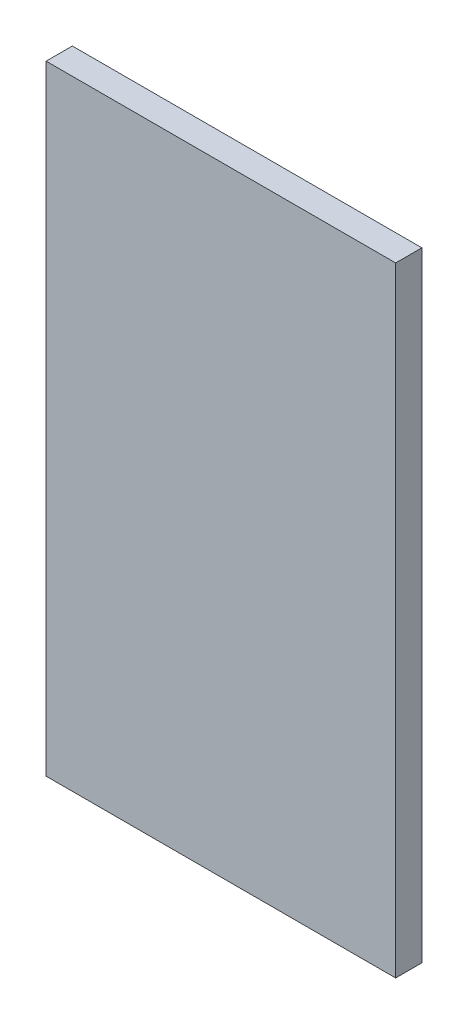
ISO-10303-21;
HEADER;
FILE_DESCRIPTION(('STEP AP214'),'2;1');
FILE_NAME('part.step','',(''),(''),'','','');
FILE_SCHEMA(('AUTOMOTIVE_DESIGN { 1 0 10303 214 1 1 1 1 }'));
ENDSEC;
DATA;
#1=APPLICATION_CONTEXT('core data for automotive mechanical design processes');
#2=APPLICATION_PROTOCOL_DEFINITION('international standard','automotive_design',2000,#1);
#3=PRODUCT_CONTEXT('',#1,'mechanical');
#4=PRODUCT('Part','Part','',(#3));
#5=PRODUCT_RELATED_PRODUCT_CATEGORY('part','',(#4));
#6=PRODUCT_DEFINITION_FORMATION('','',#4);
#7=PRODUCT_DEFINITION_CONTEXT('part definition',#1,'design');
#8=PRODUCT_DEFINITION('design','',#6,#7);
#9=PRODUCT_DEFINITION_SHAPE('','',#8);
#10=(LENGTH_UNIT() NAMED_UNIT(*) SI_UNIT(.MILLI.,.METRE.));
#11=(NAMED_UNIT(*) PLANE_ANGLE_UNIT() SI_UNIT($,.RADIAN.));
#12=(NAMED_UNIT(*) SI_UNIT($,.STERADIAN.) SOLID_ANGLE_UNIT());
#13=UNCERTAINTY_MEASURE_WITH_UNIT(LENGTH_MEASURE(1.E-05),#10,'distance_accuracy_value','');
#14=(GEOMETRIC_REPRESENTATION_CONTEXT(3) GLOBAL_UNCERTAINTY_ASSIGNED_CONTEXT((#13)) GLOBAL_UNIT_ASSIGNED_CONTEXT((#10,
#11,#12)) REPRESENTATION_CONTEXT('',''));
#15=CARTESIAN_POINT('',(0.,0.,0.));
#16=DIRECTION('',(0.,0.,1.));
#17=DIRECTION('',(1.,0.,0.));
#18=AXIS2_PLACEMENT_3D('',#15,#16,#17);
#19=CARTESIAN_POINT('',(254.,900.,19.05));
#20=DIRECTION('',(-1.,0.,0.));
#21=DIRECTION('',(0.,0.,1.));
#22=AXIS2_PLACEMENT_3D('',#19,#20,#21);
#23=PLANE('',#22);
#24=DIRECTION('',(0.,0.,-1.));
#25=VECTOR('',#24,1.);
#26=CARTESIAN_POINT('',(254.,0.,19.05));
#27=LINE('',#26,#25);
#28=CARTESIAN_POINT('',(254.,0.,19.05));
#29=VERTEX_POINT('',#28);
#30=CARTESIAN_POINT('',(254.,0.,-19.05));
#31=VERTEX_POINT('',#30);
#32=EDGE_CURVE('E98',#29,#31,#27,.T.);
#33=ORIENTED_EDGE('',*,*,#32,.T.);
#34=DIRECTION('',(0.,-1.,0.));
#35=VECTOR('',#34,1.);
#36=CARTESIAN_POINT('',(254.,900.,-19.05));
#37=LINE('',#36,#35);
#38=CARTESIAN_POINT('',(254.,900.,-19.05));
#39=VERTEX_POINT('',#38);
#40=EDGE_CURVE('E11',#39,#31,#37,.T.);
#41=ORIENTED_EDGE('',*,*,#40,.F.);
#42=DIRECTION('',(0.,0.,-1.));
#43=VECTOR('',#42,1.);
#44=CARTESIAN_POINT('',(254.,900.,19.05));
#45=LINE('',#44,#43);
#46=CARTESIAN_POINT('',(254.,900.,19.05));
#47=VERTEX_POINT('',#46);
#48=EDGE_CURVE('E86',#47,#39,#45,.T.);
#49=ORIENTED_EDGE('',*,*,#48,.F.);
#50=DIRECTION('',(0.,-1.,0.));
#51=VECTOR('',#50,1.);
#52=CARTESIAN_POINT('',(254.,900.,19.05));
#53=LINE('',#52,#51);
#54=EDGE_CURVE('E94',#47,#29,#53,.T.);
#55=ORIENTED_EDGE('',*,*,#54,.T.);
#56=EDGE_LOOP('',(#33,#41,#49,#55));
#57=FACE_BOUND('',#56,.T.);
#58=ADVANCED_FACE('F35',(#57),#23,.F.);
#59=CARTESIAN_POINT('',(-254.,900.,-19.05));
#60=DIRECTION('',(0.,0.,1.));
#61=DIRECTION('',(1.,0.,0.));
#62=AXIS2_PLACEMENT_3D('',#59,#60,#61);
#63=PLANE('',#62);
#64=DIRECTION('',(-1.,0.,0.));
#65=VECTOR('',#64,1.);
#66=CARTESIAN_POINT('',(-254.,0.,-19.05));
#67=LINE('',#66,#65);
#68=CARTESIAN_POINT('',(-254.,0.,-19.05));
#69=VERTEX_POINT('',#68);
#70=EDGE_CURVE('E90',#31,#69,#67,.T.);
#71=ORIENTED_EDGE('',*,*,#70,.T.);
#72=DIRECTION('',(0.,-1.,0.));
#73=VECTOR('',#72,1.);
#74=CARTESIAN_POINT('',(-254.,900.,-19.05));
#75=LINE('',#74,#73);
#76=CARTESIAN_POINT('',(-254.,900.,-19.05));
#77=VERTEX_POINT('',#76);
#78=EDGE_CURVE('E43',#77,#69,#75,.T.);
#79=ORIENTED_EDGE('',*,*,#78,.F.);
#80=DIRECTION('',(-1.,0.,0.));
#81=VECTOR('',#80,1.);
#82=CARTESIAN_POINT('',(-254.,900.,-19.05));
#83=LINE('',#82,#81);
#84=EDGE_CURVE('E81',#39,#77,#83,.T.);
#85=ORIENTED_EDGE('',*,*,#84,.F.);
#86=ORIENTED_EDGE('',*,*,#40,.T.);
#87=EDGE_LOOP('',(#71,#79,#85,#86));
#88=FACE_BOUND('',#87,.T.);
#89=ADVANCED_FACE('F89',(#88),#63,.F.);
#90=CARTESIAN_POINT('',(-254.,900.,19.05));
#91=DIRECTION('',(1.,0.,0.));
#92=DIRECTION('',(0.,0.,-1.));
#93=AXIS2_PLACEMENT_3D('',#90,#91,#92);
#94=PLANE('',#93);
#95=DIRECTION('',(0.,0.,1.));
#96=VECTOR('',#95,1.);
#97=CARTESIAN_POINT('',(-254.,0.,19.05));
#98=LINE('',#97,#96);
#99=CARTESIAN_POINT('',(-254.,0.,19.05));
#100=VERTEX_POINT('',#99);
#101=EDGE_CURVE('E68',#69,#100,#98,.T.);
#102=ORIENTED_EDGE('',*,*,#101,.T.);
#103=DIRECTION('',(0.,-1.,0.));
#104=VECTOR('',#103,1.);
#105=CARTESIAN_POINT('',(-254.,900.,19.05));
#106=LINE('',#105,#104);
#107=CARTESIAN_POINT('',(-254.,900.,19.05));
#108=VERTEX_POINT('',#107);
#109=EDGE_CURVE('E91',#108,#100,#106,.T.);
#110=ORIENTED_EDGE('',*,*,#109,.F.);
#111=DIRECTION('',(0.,0.,1.));
#112=VECTOR('',#111,1.);
#113=CARTESIAN_POINT('',(-254.,900.,19.05));
#114=LINE('',#113,#112);
#115=EDGE_CURVE('E84',#77,#108,#114,.T.);
#116=ORIENTED_EDGE('',*,*,#115,.F.);
#117=ORIENTED_EDGE('',*,*,#78,.T.);
#118=EDGE_LOOP('',(#102,#110,#116,#117));
#119=FACE_BOUND('',#118,.T.);
#120=ADVANCED_FACE('F92',(#119),#94,.F.);
#121=CARTESIAN_POINT('',(-254.,900.,19.05));
#122=DIRECTION('',(0.,0.,-1.));
#123=DIRECTION('',(-1.,0.,0.));
#124=AXIS2_PLACEMENT_3D('',#121,#122,#123);
#125=PLANE('',#124);
#126=DIRECTION('',(1.,0.,0.));
#127=VECTOR('',#126,1.);
#128=CARTESIAN_POINT('',(-254.,0.,19.05));
#129=LINE('',#128,#127);
#130=EDGE_CURVE('E74',#100,#29,#129,.T.);
#131=ORIENTED_EDGE('',*,*,#130,.T.);
#132=ORIENTED_EDGE('',*,*,#54,.F.);
#133=DIRECTION('',(1.,0.,0.));
#134=VECTOR('',#133,1.);
#135=CARTESIAN_POINT('',(-254.,900.,19.05));
#136=LINE('',#135,#134);
#137=EDGE_CURVE('E51',#108,#47,#136,.T.);
#138=ORIENTED_EDGE('',*,*,#137,.F.);
#139=ORIENTED_EDGE('',*,*,#109,.T.);
#140=EDGE_LOOP('',(#131,#132,#138,#139));
#141=FACE_BOUND('',#140,.T.);
#142=ADVANCED_FACE('F105',(#141),#125,.F.);
#143=CARTESIAN_POINT('',(0.,900.,0.));
#144=DIRECTION('',(0.,-1.,0.));
#145=DIRECTION('',(0.,0.,-1.));
#146=AXIS2_PLACEMENT_3D('',#143,#144,#145);
#147=PLANE('',#146);
#148=ORIENTED_EDGE('',*,*,#48,.T.);
#149=ORIENTED_EDGE('',*,*,#84,.T.);
#150=ORIENTED_EDGE('',*,*,#115,.T.);
#151=ORIENTED_EDGE('',*,*,#137,.T.);
#152=EDGE_LOOP('',(#148,#149,#150,#151));
#153=FACE_BOUND('',#152,.T.);
#154=ADVANCED_FACE('F82',(#153),#147,.F.);
#155=CARTESIAN_POINT('',(0.,0.,0.));
#156=DIRECTION('',(0.,-1.,0.));
#157=DIRECTION('',(0.,0.,-1.));
#158=AXIS2_PLACEMENT_3D('',#155,#156,#157);
#159=PLANE('',#158);
#160=ORIENTED_EDGE('',*,*,#32,.F.);
#161=ORIENTED_EDGE('',*,*,#130,.F.);
#162=ORIENTED_EDGE('',*,*,#101,.F.);
#163=ORIENTED_EDGE('',*,*,#70,.F.);
#164=EDGE_LOOP('',(#160,#161,#162,#163));
#165=FACE_BOUND('',#164,.T.);
#166=ADVANCED_FACE('F108',(#165),#159,.T.);
#167=CLOSED_SHELL('',(#58,#89,#120,#142,#154,#166));
#168=MANIFOLD_SOLID_BREP('B2',#167);
#169=ADVANCED_BREP_SHAPE_REPRESENTATION('',(#18,#168),#14);
#170=SHAPE_DEFINITION_REPRESENTATION(#9,#169);
ENDSEC;
END-ISO-10303-21;
